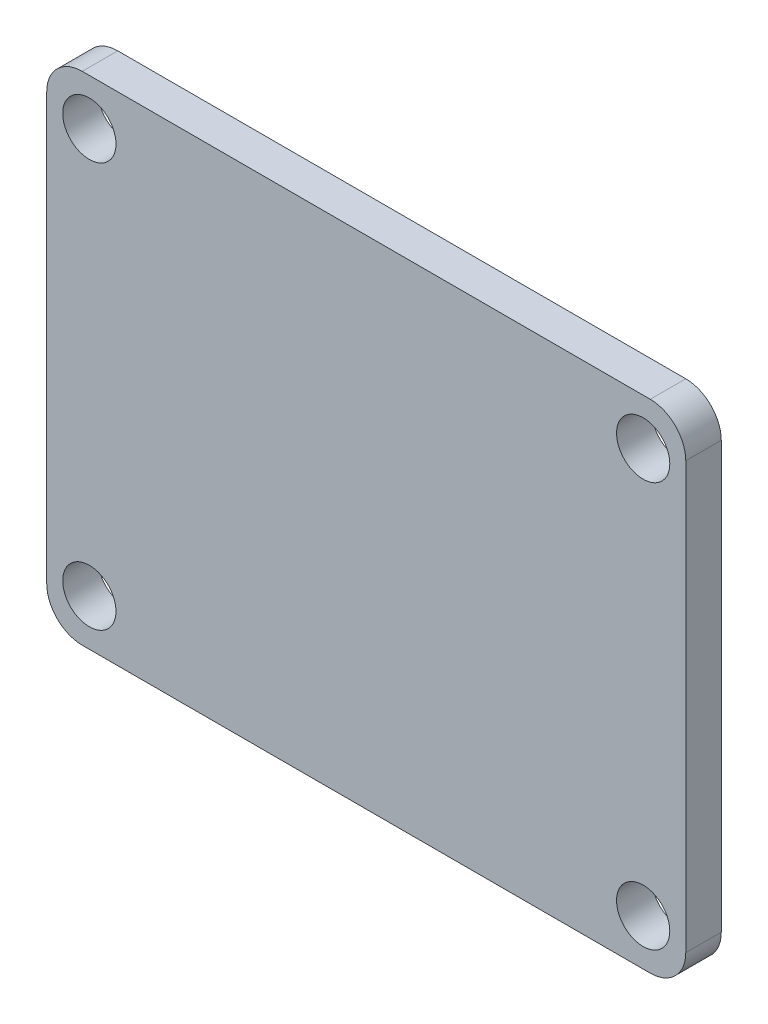
ISO-10303-21;
HEADER;
FILE_DESCRIPTION(('STEP AP214'),'2;1');
FILE_NAME('part.step','',(''),(''),'','','');
FILE_SCHEMA(('AUTOMOTIVE_DESIGN { 1 0 10303 214 1 1 1 1 }'));
ENDSEC;
DATA;
#1=APPLICATION_CONTEXT('core data for automotive mechanical design processes');
#2=APPLICATION_PROTOCOL_DEFINITION('international standard','automotive_design',2000,#1);
#3=PRODUCT_CONTEXT('',#1,'mechanical');
#4=PRODUCT('Part','Part','',(#3));
#5=PRODUCT_RELATED_PRODUCT_CATEGORY('part','',(#4));
#6=PRODUCT_DEFINITION_FORMATION('','',#4);
#7=PRODUCT_DEFINITION_CONTEXT('part definition',#1,'design');
#8=PRODUCT_DEFINITION('design','',#6,#7);
#9=PRODUCT_DEFINITION_SHAPE('','',#8);
#10=(LENGTH_UNIT() NAMED_UNIT(*) SI_UNIT(.MILLI.,.METRE.));
#11=(NAMED_UNIT(*) PLANE_ANGLE_UNIT() SI_UNIT($,.RADIAN.));
#12=(NAMED_UNIT(*) SI_UNIT($,.STERADIAN.) SOLID_ANGLE_UNIT());
#13=UNCERTAINTY_MEASURE_WITH_UNIT(LENGTH_MEASURE(1.E-05),#10,'distance_accuracy_value','');
#14=(GEOMETRIC_REPRESENTATION_CONTEXT(3) GLOBAL_UNCERTAINTY_ASSIGNED_CONTEXT((#13)) GLOBAL_UNIT_ASSIGNED_CONTEXT((#10,
#11,#12)) REPRESENTATION_CONTEXT('',''));
#15=CARTESIAN_POINT('',(0.,0.,0.));
#16=DIRECTION('',(0.,0.,1.));
#17=DIRECTION('',(1.,0.,0.));
#18=AXIS2_PLACEMENT_3D('',#15,#16,#17);
#19=CARTESIAN_POINT('',(-180.,140.,10.));
#20=DIRECTION('',(1.,0.,0.));
#21=DIRECTION('',(0.,0.,-1.));
#22=AXIS2_PLACEMENT_3D('',#19,#20,#21);
#23=PLANE('',#22);
#24=DIRECTION('',(0.,-1.,0.));
#25=VECTOR('',#24,1.);
#26=CARTESIAN_POINT('',(-180.,140.,10.));
#27=LINE('',#26,#25);
#28=CARTESIAN_POINT('',(-180.,130.,10.));
#29=VERTEX_POINT('',#28);
#30=CARTESIAN_POINT('',(-180.,10.,10.));
#31=VERTEX_POINT('',#30);
#32=EDGE_CURVE('E126',#29,#31,#27,.T.);
#33=ORIENTED_EDGE('',*,*,#32,.F.);
#34=DIRECTION('',(0.,0.,-1.));
#35=VECTOR('',#34,1.);
#36=CARTESIAN_POINT('',(-180.,130.,10.));
#37=LINE('',#36,#35);
#38=CARTESIAN_POINT('',(-180.,130.,0.));
#39=VERTEX_POINT('',#38);
#40=EDGE_CURVE('E11',#29,#39,#37,.T.);
#41=ORIENTED_EDGE('',*,*,#40,.T.);
#42=DIRECTION('',(0.,-1.,0.));
#43=VECTOR('',#42,1.);
#44=CARTESIAN_POINT('',(-180.,140.,0.));
#45=LINE('',#44,#43);
#46=CARTESIAN_POINT('',(-180.,10.,0.));
#47=VERTEX_POINT('',#46);
#48=EDGE_CURVE('E128',#39,#47,#45,.T.);
#49=ORIENTED_EDGE('',*,*,#48,.T.);
#50=DIRECTION('',(0.,0.,-1.));
#51=VECTOR('',#50,1.);
#52=CARTESIAN_POINT('',(-180.,10.,10.));
#53=LINE('',#52,#51);
#54=EDGE_CURVE('E39',#47,#31,#53,.F.);
#55=ORIENTED_EDGE('',*,*,#54,.T.);
#56=EDGE_LOOP('',(#33,#41,#49,#55));
#57=FACE_BOUND('',#56,.T.);
#58=ADVANCED_FACE('F31',(#57),#23,.F.);
#59=CARTESIAN_POINT('',(-180.,0.,10.));
#60=DIRECTION('',(0.,1.,0.));
#61=DIRECTION('',(0.,0.,1.));
#62=AXIS2_PLACEMENT_3D('',#59,#60,#61);
#63=PLANE('',#62);
#64=DIRECTION('',(1.,0.,0.));
#65=VECTOR('',#64,1.);
#66=CARTESIAN_POINT('',(-180.,0.,0.));
#67=LINE('',#66,#65);
#68=CARTESIAN_POINT('',(-170.,0.,0.));
#69=VERTEX_POINT('',#68);
#70=CARTESIAN_POINT('',(-10.0000000000001,0.,0.));
#71=VERTEX_POINT('',#70);
#72=EDGE_CURVE('E124',#69,#71,#67,.T.);
#73=ORIENTED_EDGE('',*,*,#72,.T.);
#74=DIRECTION('',(0.,0.,-1.));
#75=VECTOR('',#74,1.);
#76=CARTESIAN_POINT('',(-10.,0.,10.));
#77=LINE('',#76,#75);
#78=CARTESIAN_POINT('',(-10.0000000000001,0.,10.));
#79=VERTEX_POINT('',#78);
#80=EDGE_CURVE('E103',#71,#79,#77,.F.);
#81=ORIENTED_EDGE('',*,*,#80,.T.);
#82=DIRECTION('',(1.,0.,0.));
#83=VECTOR('',#82,1.);
#84=CARTESIAN_POINT('',(-180.,0.,10.));
#85=LINE('',#84,#83);
#86=CARTESIAN_POINT('',(-170.,0.,10.));
#87=VERTEX_POINT('',#86);
#88=EDGE_CURVE('E164',#87,#79,#85,.T.);
#89=ORIENTED_EDGE('',*,*,#88,.F.);
#90=DIRECTION('',(0.,0.,-1.));
#91=VECTOR('',#90,1.);
#92=CARTESIAN_POINT('',(-170.,0.,10.));
#93=LINE('',#92,#91);
#94=EDGE_CURVE('E108',#87,#69,#93,.T.);
#95=ORIENTED_EDGE('',*,*,#94,.T.);
#96=EDGE_LOOP('',(#73,#81,#89,#95));
#97=FACE_BOUND('',#96,.T.);
#98=ADVANCED_FACE('F168',(#97),#63,.F.);
#99=CARTESIAN_POINT('',(0.,140.,10.));
#100=DIRECTION('',(-1.,0.,0.));
#101=DIRECTION('',(0.,-1.,0.));
#102=AXIS2_PLACEMENT_3D('',#99,#100,#101);
#103=PLANE('',#102);
#104=DIRECTION('',(0.,1.,0.));
#105=VECTOR('',#104,1.);
#106=CARTESIAN_POINT('',(0.,140.,10.));
#107=LINE('',#106,#105);
#108=CARTESIAN_POINT('',(0.,10.,10.));
#109=VERTEX_POINT('',#108);
#110=CARTESIAN_POINT('',(0.,130.,10.));
#111=VERTEX_POINT('',#110);
#112=EDGE_CURVE('E117',#109,#111,#107,.T.);
#113=ORIENTED_EDGE('',*,*,#112,.F.);
#114=DIRECTION('',(0.,0.,-1.));
#115=VECTOR('',#114,1.);
#116=CARTESIAN_POINT('',(0.,10.,10.));
#117=LINE('',#116,#115);
#118=CARTESIAN_POINT('',(0.,10.,0.));
#119=VERTEX_POINT('',#118);
#120=EDGE_CURVE('E102',#109,#119,#117,.T.);
#121=ORIENTED_EDGE('',*,*,#120,.T.);
#122=DIRECTION('',(0.,1.,0.));
#123=VECTOR('',#122,1.);
#124=CARTESIAN_POINT('',(0.,140.,0.));
#125=LINE('',#124,#123);
#126=CARTESIAN_POINT('',(0.,130.,0.));
#127=VERTEX_POINT('',#126);
#128=EDGE_CURVE('E115',#119,#127,#125,.T.);
#129=ORIENTED_EDGE('',*,*,#128,.T.);
#130=DIRECTION('',(0.,0.,-1.));
#131=VECTOR('',#130,1.);
#132=CARTESIAN_POINT('',(0.,130.,10.));
#133=LINE('',#132,#131);
#134=EDGE_CURVE('E119',#127,#111,#133,.F.);
#135=ORIENTED_EDGE('',*,*,#134,.T.);
#136=EDGE_LOOP('',(#113,#121,#129,#135));
#137=FACE_BOUND('',#136,.T.);
#138=ADVANCED_FACE('F114',(#137),#103,.F.);
#139=CARTESIAN_POINT('',(-180.,140.,10.));
#140=DIRECTION('',(0.,-1.,0.));
#141=DIRECTION('',(0.,0.,-1.));
#142=AXIS2_PLACEMENT_3D('',#139,#140,#141);
#143=PLANE('',#142);
#144=DIRECTION('',(-1.,0.,0.));
#145=VECTOR('',#144,1.);
#146=CARTESIAN_POINT('',(-180.,140.,10.));
#147=LINE('',#146,#145);
#148=CARTESIAN_POINT('',(-10.0000000000001,140.,10.));
#149=VERTEX_POINT('',#148);
#150=CARTESIAN_POINT('',(-170.,140.,10.));
#151=VERTEX_POINT('',#150);
#152=EDGE_CURVE('E132',#149,#151,#147,.T.);
#153=ORIENTED_EDGE('',*,*,#152,.F.);
#154=DIRECTION('',(0.,0.,-1.));
#155=VECTOR('',#154,1.);
#156=CARTESIAN_POINT('',(-10.,140.,10.));
#157=LINE('',#156,#155);
#158=CARTESIAN_POINT('',(-10.0000000000001,140.,0.));
#159=VERTEX_POINT('',#158);
#160=EDGE_CURVE('E149',#149,#159,#157,.T.);
#161=ORIENTED_EDGE('',*,*,#160,.T.);
#162=DIRECTION('',(-1.,0.,0.));
#163=VECTOR('',#162,1.);
#164=CARTESIAN_POINT('',(-180.,140.,0.));
#165=LINE('',#164,#163);
#166=CARTESIAN_POINT('',(-170.,140.,0.));
#167=VERTEX_POINT('',#166);
#168=EDGE_CURVE('E123',#159,#167,#165,.T.);
#169=ORIENTED_EDGE('',*,*,#168,.T.);
#170=DIRECTION('',(0.,0.,-1.));
#171=VECTOR('',#170,1.);
#172=CARTESIAN_POINT('',(-170.,140.,10.));
#173=LINE('',#172,#171);
#174=EDGE_CURVE('E46',#167,#151,#173,.F.);
#175=ORIENTED_EDGE('',*,*,#174,.T.);
#176=EDGE_LOOP('',(#153,#161,#169,#175));
#177=FACE_BOUND('',#176,.T.);
#178=ADVANCED_FACE('F209',(#177),#143,.F.);
#179=CARTESIAN_POINT('',(-180.,0.,10.));
#180=DIRECTION('',(0.,0.,1.));
#181=DIRECTION('',(1.,0.,0.));
#182=AXIS2_PLACEMENT_3D('',#179,#180,#181);
#183=PLANE('',#182);
#184=CARTESIAN_POINT('',(-168.,13.,10.));
#185=DIRECTION('',(0.,0.,1.));
#186=DIRECTION('',(1.,0.,0.));
#187=AXIS2_PLACEMENT_3D('',#184,#185,#186);
#188=CIRCLE('',#187,7.50000000000001);
#189=CARTESIAN_POINT('',(-160.5,13.,10.));
#190=VERTEX_POINT('',#189);
#191=EDGE_CURVE('E192',#190,#190,#188,.T.);
#192=ORIENTED_EDGE('',*,*,#191,.F.);
#193=EDGE_LOOP('',(#192));
#194=FACE_BOUND('',#193,.T.);
#195=CARTESIAN_POINT('',(-12.0000000000001,13.,10.));
#196=DIRECTION('',(0.,0.,1.));
#197=DIRECTION('',(1.,0.,0.));
#198=AXIS2_PLACEMENT_3D('',#195,#196,#197);
#199=CIRCLE('',#198,7.5);
#200=CARTESIAN_POINT('',(-4.50000000000007,13.,10.));
#201=VERTEX_POINT('',#200);
#202=EDGE_CURVE('E186',#201,#201,#199,.T.);
#203=ORIENTED_EDGE('',*,*,#202,.F.);
#204=EDGE_LOOP('',(#203));
#205=FACE_BOUND('',#204,.T.);
#206=CARTESIAN_POINT('',(-12.0000000000001,127.,10.));
#207=DIRECTION('',(0.,0.,1.));
#208=DIRECTION('',(1.,0.,0.));
#209=AXIS2_PLACEMENT_3D('',#206,#207,#208);
#210=CIRCLE('',#209,7.50000000000001);
#211=CARTESIAN_POINT('',(-4.50000000000006,127.,10.));
#212=VERTEX_POINT('',#211);
#213=EDGE_CURVE('E180',#212,#212,#210,.T.);
#214=ORIENTED_EDGE('',*,*,#213,.F.);
#215=EDGE_LOOP('',(#214));
#216=FACE_BOUND('',#215,.T.);
#217=CARTESIAN_POINT('',(-168.,127.,10.));
#218=DIRECTION('',(0.,0.,1.));
#219=DIRECTION('',(1.,0.,0.));
#220=AXIS2_PLACEMENT_3D('',#217,#218,#219);
#221=CIRCLE('',#220,7.50000000000001);
#222=CARTESIAN_POINT('',(-160.5,127.,10.));
#223=VERTEX_POINT('',#222);
#224=EDGE_CURVE('E171',#223,#223,#221,.T.);
#225=ORIENTED_EDGE('',*,*,#224,.F.);
#226=EDGE_LOOP('',(#225));
#227=FACE_BOUND('',#226,.T.);
#228=ORIENTED_EDGE('',*,*,#88,.T.);
#229=CARTESIAN_POINT('',(-10.,10.,10.));
#230=DIRECTION('',(0.,0.,1.));
#231=DIRECTION('',(1.,0.,0.));
#232=AXIS2_PLACEMENT_3D('',#229,#230,#231);
#233=CIRCLE('',#232,10.);
#234=EDGE_CURVE('E146',#79,#109,#233,.T.);
#235=ORIENTED_EDGE('',*,*,#234,.T.);
#236=ORIENTED_EDGE('',*,*,#112,.T.);
#237=CARTESIAN_POINT('',(-10.,130.,10.));
#238=DIRECTION('',(0.,0.,1.));
#239=DIRECTION('',(1.,0.,0.));
#240=AXIS2_PLACEMENT_3D('',#237,#238,#239);
#241=CIRCLE('',#240,10.);
#242=EDGE_CURVE('E53',#111,#149,#241,.T.);
#243=ORIENTED_EDGE('',*,*,#242,.T.);
#244=ORIENTED_EDGE('',*,*,#152,.T.);
#245=CARTESIAN_POINT('',(-170.,130.,10.));
#246=DIRECTION('',(0.,0.,1.));
#247=DIRECTION('',(1.,0.,0.));
#248=AXIS2_PLACEMENT_3D('',#245,#246,#247);
#249=CIRCLE('',#248,10.);
#250=EDGE_CURVE('E143',#151,#29,#249,.T.);
#251=ORIENTED_EDGE('',*,*,#250,.T.);
#252=ORIENTED_EDGE('',*,*,#32,.T.);
#253=CARTESIAN_POINT('',(-170.,10.,10.));
#254=DIRECTION('',(0.,0.,1.));
#255=DIRECTION('',(1.,0.,0.));
#256=AXIS2_PLACEMENT_3D('',#253,#254,#255);
#257=CIRCLE('',#256,10.);
#258=EDGE_CURVE('E141',#31,#87,#257,.T.);
#259=ORIENTED_EDGE('',*,*,#258,.T.);
#260=EDGE_LOOP('',(#228,#235,#236,#243,#244,#251,#252,#259));
#261=FACE_BOUND('',#260,.T.);
#262=ADVANCED_FACE('F161',(#194,#205,#216,#227,#261),#183,.T.);
#263=CARTESIAN_POINT('',(-180.,0.,0.));
#264=DIRECTION('',(0.,0.,1.));
#265=DIRECTION('',(1.,0.,0.));
#266=AXIS2_PLACEMENT_3D('',#263,#264,#265);
#267=PLANE('',#266);
#268=CARTESIAN_POINT('',(-168.,13.,0.));
#269=DIRECTION('',(0.,0.,1.));
#270=DIRECTION('',(1.,0.,0.));
#271=AXIS2_PLACEMENT_3D('',#268,#269,#270);
#272=CIRCLE('',#271,7.50000000000001);
#273=CARTESIAN_POINT('',(-160.5,13.,0.));
#274=VERTEX_POINT('',#273);
#275=EDGE_CURVE('E189',#274,#274,#272,.T.);
#276=ORIENTED_EDGE('',*,*,#275,.T.);
#277=EDGE_LOOP('',(#276));
#278=FACE_BOUND('',#277,.T.);
#279=CARTESIAN_POINT('',(-12.0000000000001,13.,0.));
#280=DIRECTION('',(0.,0.,1.));
#281=DIRECTION('',(1.,0.,0.));
#282=AXIS2_PLACEMENT_3D('',#279,#280,#281);
#283=CIRCLE('',#282,7.5);
#284=CARTESIAN_POINT('',(-4.50000000000007,13.,0.));
#285=VERTEX_POINT('',#284);
#286=EDGE_CURVE('E183',#285,#285,#283,.T.);
#287=ORIENTED_EDGE('',*,*,#286,.T.);
#288=EDGE_LOOP('',(#287));
#289=FACE_BOUND('',#288,.T.);
#290=CARTESIAN_POINT('',(-12.0000000000001,127.,0.));
#291=DIRECTION('',(0.,0.,1.));
#292=DIRECTION('',(1.,0.,0.));
#293=AXIS2_PLACEMENT_3D('',#290,#291,#292);
#294=CIRCLE('',#293,7.50000000000001);
#295=CARTESIAN_POINT('',(-4.50000000000006,127.,0.));
#296=VERTEX_POINT('',#295);
#297=EDGE_CURVE('E178',#296,#296,#294,.T.);
#298=ORIENTED_EDGE('',*,*,#297,.T.);
#299=EDGE_LOOP('',(#298));
#300=FACE_BOUND('',#299,.T.);
#301=CARTESIAN_POINT('',(-168.,127.,0.));
#302=DIRECTION('',(0.,0.,1.));
#303=DIRECTION('',(1.,0.,0.));
#304=AXIS2_PLACEMENT_3D('',#301,#302,#303);
#305=CIRCLE('',#304,7.50000000000001);
#306=CARTESIAN_POINT('',(-160.5,127.,0.));
#307=VERTEX_POINT('',#306);
#308=EDGE_CURVE('E169',#307,#307,#305,.T.);
#309=ORIENTED_EDGE('',*,*,#308,.T.);
#310=EDGE_LOOP('',(#309));
#311=FACE_BOUND('',#310,.T.);
#312=ORIENTED_EDGE('',*,*,#128,.F.);
#313=CARTESIAN_POINT('',(-10.,10.,0.));
#314=DIRECTION('',(0.,0.,1.));
#315=DIRECTION('',(1.,0.,0.));
#316=AXIS2_PLACEMENT_3D('',#313,#314,#315);
#317=CIRCLE('',#316,10.);
#318=EDGE_CURVE('E98',#119,#71,#317,.F.);
#319=ORIENTED_EDGE('',*,*,#318,.T.);
#320=ORIENTED_EDGE('',*,*,#72,.F.);
#321=CARTESIAN_POINT('',(-170.,10.,0.));
#322=DIRECTION('',(0.,0.,1.));
#323=DIRECTION('',(1.,0.,0.));
#324=AXIS2_PLACEMENT_3D('',#321,#322,#323);
#325=CIRCLE('',#324,10.);
#326=EDGE_CURVE('E118',#69,#47,#325,.F.);
#327=ORIENTED_EDGE('',*,*,#326,.T.);
#328=ORIENTED_EDGE('',*,*,#48,.F.);
#329=CARTESIAN_POINT('',(-170.,130.,0.));
#330=DIRECTION('',(0.,0.,1.));
#331=DIRECTION('',(1.,0.,0.));
#332=AXIS2_PLACEMENT_3D('',#329,#330,#331);
#333=CIRCLE('',#332,10.);
#334=EDGE_CURVE('E135',#39,#167,#333,.F.);
#335=ORIENTED_EDGE('',*,*,#334,.T.);
#336=ORIENTED_EDGE('',*,*,#168,.F.);
#337=CARTESIAN_POINT('',(-10.,130.,0.));
#338=DIRECTION('',(0.,0.,1.));
#339=DIRECTION('',(1.,0.,0.));
#340=AXIS2_PLACEMENT_3D('',#337,#338,#339);
#341=CIRCLE('',#340,10.);
#342=EDGE_CURVE('E109',#159,#127,#341,.F.);
#343=ORIENTED_EDGE('',*,*,#342,.T.);
#344=EDGE_LOOP('',(#312,#319,#320,#327,#328,#335,#336,#343));
#345=FACE_BOUND('',#344,.T.);
#346=ADVANCED_FACE('F121',(#278,#289,#300,#311,#345),#267,.F.);
#347=CARTESIAN_POINT('',(-168.,127.,0.));
#348=DIRECTION('',(0.,0.,1.));
#349=DIRECTION('',(1.,0.,0.));
#350=AXIS2_PLACEMENT_3D('',#347,#348,#349);
#351=CYLINDRICAL_SURFACE('',#350,7.50000000000001);
#352=ORIENTED_EDGE('',*,*,#308,.F.);
#353=EDGE_LOOP('',(#352));
#354=FACE_BOUND('',#353,.T.);
#355=ORIENTED_EDGE('',*,*,#224,.T.);
#356=EDGE_LOOP('',(#355));
#357=FACE_BOUND('',#356,.T.);
#358=ADVANCED_FACE('F217',(#354,#357),#351,.F.);
#359=CARTESIAN_POINT('',(-12.0000000000001,127.,0.));
#360=DIRECTION('',(0.,0.,1.));
#361=DIRECTION('',(1.,0.,0.));
#362=AXIS2_PLACEMENT_3D('',#359,#360,#361);
#363=CYLINDRICAL_SURFACE('',#362,7.50000000000001);
#364=ORIENTED_EDGE('',*,*,#297,.F.);
#365=EDGE_LOOP('',(#364));
#366=FACE_BOUND('',#365,.T.);
#367=ORIENTED_EDGE('',*,*,#213,.T.);
#368=EDGE_LOOP('',(#367));
#369=FACE_BOUND('',#368,.T.);
#370=ADVANCED_FACE('F219',(#366,#369),#363,.F.);
#371=CARTESIAN_POINT('',(-12.0000000000001,13.,0.));
#372=DIRECTION('',(0.,0.,1.));
#373=DIRECTION('',(1.,0.,0.));
#374=AXIS2_PLACEMENT_3D('',#371,#372,#373);
#375=CYLINDRICAL_SURFACE('',#374,7.5);
#376=ORIENTED_EDGE('',*,*,#286,.F.);
#377=EDGE_LOOP('',(#376));
#378=FACE_BOUND('',#377,.T.);
#379=ORIENTED_EDGE('',*,*,#202,.T.);
#380=EDGE_LOOP('',(#379));
#381=FACE_BOUND('',#380,.T.);
#382=ADVANCED_FACE('F203',(#378,#381),#375,.F.);
#383=CARTESIAN_POINT('',(-168.,13.,0.));
#384=DIRECTION('',(0.,0.,1.));
#385=DIRECTION('',(1.,0.,0.));
#386=AXIS2_PLACEMENT_3D('',#383,#384,#385);
#387=CYLINDRICAL_SURFACE('',#386,7.50000000000001);
#388=ORIENTED_EDGE('',*,*,#275,.F.);
#389=EDGE_LOOP('',(#388));
#390=FACE_BOUND('',#389,.T.);
#391=ORIENTED_EDGE('',*,*,#191,.T.);
#392=EDGE_LOOP('',(#391));
#393=FACE_BOUND('',#392,.T.);
#394=ADVANCED_FACE('F200',(#390,#393),#387,.F.);
#395=CARTESIAN_POINT('',(-10.,10.,10.));
#396=DIRECTION('',(0.,0.,-1.));
#397=DIRECTION('',(-1.,0.,0.));
#398=AXIS2_PLACEMENT_3D('',#395,#396,#397);
#399=CYLINDRICAL_SURFACE('',#398,10.);
#400=ORIENTED_EDGE('',*,*,#234,.F.);
#401=ORIENTED_EDGE('',*,*,#80,.F.);
#402=ORIENTED_EDGE('',*,*,#318,.F.);
#403=ORIENTED_EDGE('',*,*,#120,.F.);
#404=EDGE_LOOP('',(#400,#401,#402,#403));
#405=FACE_BOUND('',#404,.T.);
#406=ADVANCED_FACE('F101',(#405),#399,.T.);
#407=CARTESIAN_POINT('',(-10.,130.,10.));
#408=DIRECTION('',(0.,0.,-1.));
#409=DIRECTION('',(-1.,0.,0.));
#410=AXIS2_PLACEMENT_3D('',#407,#408,#409);
#411=CYLINDRICAL_SURFACE('',#410,10.);
#412=ORIENTED_EDGE('',*,*,#242,.F.);
#413=ORIENTED_EDGE('',*,*,#134,.F.);
#414=ORIENTED_EDGE('',*,*,#342,.F.);
#415=ORIENTED_EDGE('',*,*,#160,.F.);
#416=EDGE_LOOP('',(#412,#413,#414,#415));
#417=FACE_BOUND('',#416,.T.);
#418=ADVANCED_FACE('F240',(#417),#411,.T.);
#419=CARTESIAN_POINT('',(-170.,130.,10.));
#420=DIRECTION('',(0.,0.,-1.));
#421=DIRECTION('',(-1.,0.,0.));
#422=AXIS2_PLACEMENT_3D('',#419,#420,#421);
#423=CYLINDRICAL_SURFACE('',#422,10.);
#424=ORIENTED_EDGE('',*,*,#250,.F.);
#425=ORIENTED_EDGE('',*,*,#174,.F.);
#426=ORIENTED_EDGE('',*,*,#334,.F.);
#427=ORIENTED_EDGE('',*,*,#40,.F.);
#428=EDGE_LOOP('',(#424,#425,#426,#427));
#429=FACE_BOUND('',#428,.T.);
#430=ADVANCED_FACE('F242',(#429),#423,.T.);
#431=CARTESIAN_POINT('',(-170.,10.,10.));
#432=DIRECTION('',(0.,0.,-1.));
#433=DIRECTION('',(-1.,0.,0.));
#434=AXIS2_PLACEMENT_3D('',#431,#432,#433);
#435=CYLINDRICAL_SURFACE('',#434,10.);
#436=ORIENTED_EDGE('',*,*,#258,.F.);
#437=ORIENTED_EDGE('',*,*,#54,.F.);
#438=ORIENTED_EDGE('',*,*,#326,.F.);
#439=ORIENTED_EDGE('',*,*,#94,.F.);
#440=EDGE_LOOP('',(#436,#437,#438,#439));
#441=FACE_BOUND('',#440,.T.);
#442=ADVANCED_FACE('F33',(#441),#435,.T.);
#443=CLOSED_SHELL('',(#58,#98,#138,#178,#262,#346,#358,#370,#382,#394,#406,#418,#430,#442));
#444=MANIFOLD_SOLID_BREP('B2',#443);
#445=ADVANCED_BREP_SHAPE_REPRESENTATION('',(#18,#444),#14);
#446=SHAPE_DEFINITION_REPRESENTATION(#9,#445);
ENDSEC;
END-ISO-10303-21;
